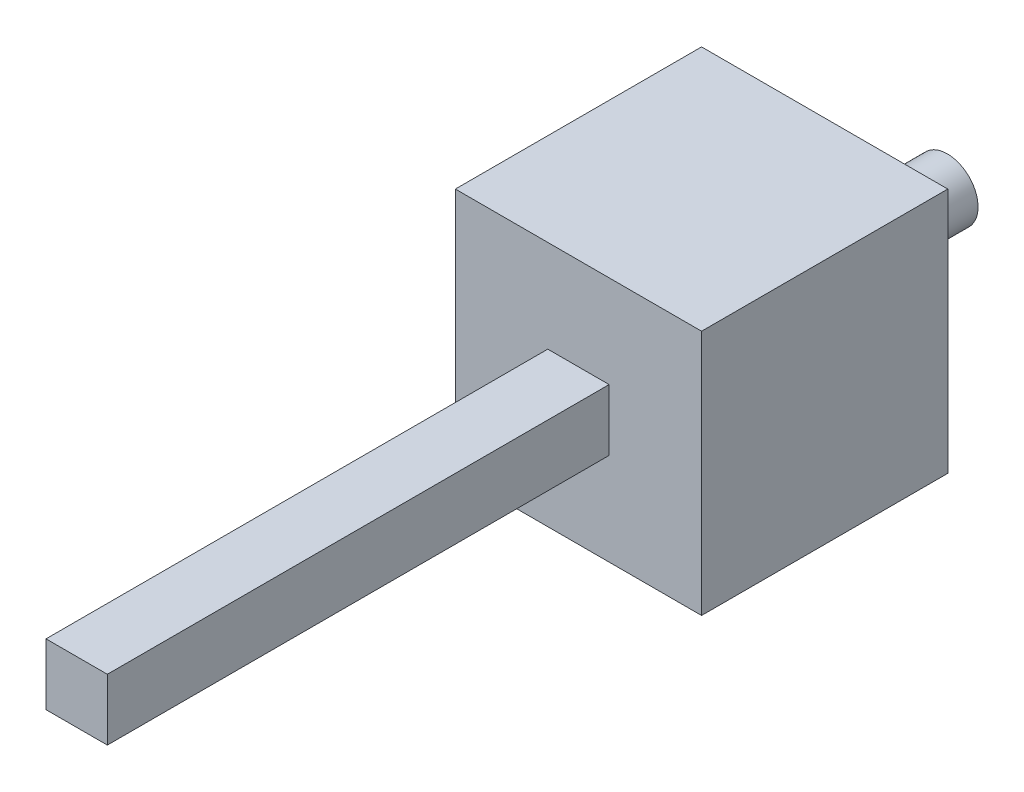
ISO-10303-21;
HEADER;
FILE_DESCRIPTION(('STEP AP214'),'2;1');
FILE_NAME('part.step','',(''),(''),'','','');
FILE_SCHEMA(('AUTOMOTIVE_DESIGN { 1 0 10303 214 1 1 1 1 }'));
ENDSEC;
DATA;
#1=APPLICATION_CONTEXT('core data for automotive mechanical design processes');
#2=APPLICATION_PROTOCOL_DEFINITION('international standard','automotive_design',2000,#1);
#3=PRODUCT_CONTEXT('',#1,'mechanical');
#4=PRODUCT('Part','Part','',(#3));
#5=PRODUCT_RELATED_PRODUCT_CATEGORY('part','',(#4));
#6=PRODUCT_DEFINITION_FORMATION('','',#4);
#7=PRODUCT_DEFINITION_CONTEXT('part definition',#1,'design');
#8=PRODUCT_DEFINITION('design','',#6,#7);
#9=PRODUCT_DEFINITION_SHAPE('','',#8);
#10=(LENGTH_UNIT() NAMED_UNIT(*) SI_UNIT(.MILLI.,.METRE.));
#11=(NAMED_UNIT(*) PLANE_ANGLE_UNIT() SI_UNIT($,.RADIAN.));
#12=(NAMED_UNIT(*) SI_UNIT($,.STERADIAN.) SOLID_ANGLE_UNIT());
#13=UNCERTAINTY_MEASURE_WITH_UNIT(LENGTH_MEASURE(1.E-05),#10,'distance_accuracy_value','');
#14=(GEOMETRIC_REPRESENTATION_CONTEXT(3) GLOBAL_UNCERTAINTY_ASSIGNED_CONTEXT((#13)) GLOBAL_UNIT_ASSIGNED_CONTEXT((#10,
#11,#12)) REPRESENTATION_CONTEXT('',''));
#15=CARTESIAN_POINT('',(0.,0.,0.));
#16=DIRECTION('',(0.,0.,1.));
#17=DIRECTION('',(1.,0.,0.));
#18=AXIS2_PLACEMENT_3D('',#15,#16,#17);
#19=CARTESIAN_POINT('',(-1.0033,-1.0033,2.0066));
#20=DIRECTION('',(1.,0.,0.));
#21=DIRECTION('',(0.,0.,-1.));
#22=AXIS2_PLACEMENT_3D('',#19,#20,#21);
#23=PLANE('',#22);
#24=DIRECTION('',(0.,-1.,0.));
#25=VECTOR('',#24,1.);
#26=CARTESIAN_POINT('',(-1.0033,-1.0033,0.));
#27=LINE('',#26,#25);
#28=CARTESIAN_POINT('',(-1.0033,1.0033,0.));
#29=VERTEX_POINT('',#28);
#30=CARTESIAN_POINT('',(-1.0033,-1.0033,0.));
#31=VERTEX_POINT('',#30);
#32=EDGE_CURVE('E158',#29,#31,#27,.T.);
#33=ORIENTED_EDGE('',*,*,#32,.T.);
#34=DIRECTION('',(0.,0.,-1.));
#35=VECTOR('',#34,1.);
#36=CARTESIAN_POINT('',(-1.0033,-1.0033,2.0066));
#37=LINE('',#36,#35);
#38=CARTESIAN_POINT('',(-1.0033,-1.0033,2.0066));
#39=VERTEX_POINT('',#38);
#40=EDGE_CURVE('E42',#39,#31,#37,.T.);
#41=ORIENTED_EDGE('',*,*,#40,.F.);
#42=DIRECTION('',(0.,-1.,0.));
#43=VECTOR('',#42,1.);
#44=CARTESIAN_POINT('',(-1.0033,-1.0033,2.0066));
#45=LINE('',#44,#43);
#46=CARTESIAN_POINT('',(-1.0033,1.0033,2.0066));
#47=VERTEX_POINT('',#46);
#48=EDGE_CURVE('E159',#47,#39,#45,.T.);
#49=ORIENTED_EDGE('',*,*,#48,.F.);
#50=DIRECTION('',(0.,0.,-1.));
#51=VECTOR('',#50,1.);
#52=CARTESIAN_POINT('',(-1.0033,1.0033,2.0066));
#53=LINE('',#52,#51);
#54=EDGE_CURVE('E173',#47,#29,#53,.T.);
#55=ORIENTED_EDGE('',*,*,#54,.T.);
#56=EDGE_LOOP('',(#33,#41,#49,#55));
#57=FACE_BOUND('',#56,.T.);
#58=ADVANCED_FACE('F39',(#57),#23,.F.);
#59=CARTESIAN_POINT('',(1.0033,-1.0033,2.0066));
#60=DIRECTION('',(0.,1.,0.));
#61=DIRECTION('',(-1.,0.,0.));
#62=AXIS2_PLACEMENT_3D('',#59,#60,#61);
#63=PLANE('',#62);
#64=DIRECTION('',(1.,0.,0.));
#65=VECTOR('',#64,1.);
#66=CARTESIAN_POINT('',(1.0033,-1.0033,0.));
#67=LINE('',#66,#65);
#68=CARTESIAN_POINT('',(1.0033,-1.0033,0.));
#69=VERTEX_POINT('',#68);
#70=EDGE_CURVE('E177',#31,#69,#67,.T.);
#71=ORIENTED_EDGE('',*,*,#70,.T.);
#72=DIRECTION('',(0.,0.,-1.));
#73=VECTOR('',#72,1.);
#74=CARTESIAN_POINT('',(1.0033,-1.0033,2.0066));
#75=LINE('',#74,#73);
#76=CARTESIAN_POINT('',(1.0033,-1.0033,2.0066));
#77=VERTEX_POINT('',#76);
#78=EDGE_CURVE('E191',#77,#69,#75,.T.);
#79=ORIENTED_EDGE('',*,*,#78,.F.);
#80=DIRECTION('',(1.,0.,0.));
#81=VECTOR('',#80,1.);
#82=CARTESIAN_POINT('',(1.0033,-1.0033,2.0066));
#83=LINE('',#82,#81);
#84=EDGE_CURVE('E163',#39,#77,#83,.T.);
#85=ORIENTED_EDGE('',*,*,#84,.F.);
#86=ORIENTED_EDGE('',*,*,#40,.T.);
#87=EDGE_LOOP('',(#71,#79,#85,#86));
#88=FACE_BOUND('',#87,.T.);
#89=ADVANCED_FACE('F202',(#88),#63,.F.);
#90=CARTESIAN_POINT('',(1.0033,-1.0033,2.0066));
#91=DIRECTION('',(-1.,0.,0.));
#92=DIRECTION('',(0.,0.,1.));
#93=AXIS2_PLACEMENT_3D('',#90,#91,#92);
#94=PLANE('',#93);
#95=DIRECTION('',(0.,1.,0.));
#96=VECTOR('',#95,1.);
#97=CARTESIAN_POINT('',(1.0033,-1.0033,0.));
#98=LINE('',#97,#96);
#99=CARTESIAN_POINT('',(1.0033,1.0033,0.));
#100=VERTEX_POINT('',#99);
#101=EDGE_CURVE('E180',#69,#100,#98,.T.);
#102=ORIENTED_EDGE('',*,*,#101,.T.);
#103=DIRECTION('',(0.,0.,-1.));
#104=VECTOR('',#103,1.);
#105=CARTESIAN_POINT('',(1.0033,1.0033,2.0066));
#106=LINE('',#105,#104);
#107=CARTESIAN_POINT('',(1.0033,1.0033,2.0066));
#108=VERTEX_POINT('',#107);
#109=EDGE_CURVE('E188',#108,#100,#106,.T.);
#110=ORIENTED_EDGE('',*,*,#109,.F.);
#111=DIRECTION('',(0.,1.,0.));
#112=VECTOR('',#111,1.);
#113=CARTESIAN_POINT('',(1.0033,-1.0033,2.0066));
#114=LINE('',#113,#112);
#115=EDGE_CURVE('E167',#77,#108,#114,.T.);
#116=ORIENTED_EDGE('',*,*,#115,.F.);
#117=ORIENTED_EDGE('',*,*,#78,.T.);
#118=EDGE_LOOP('',(#102,#110,#116,#117));
#119=FACE_BOUND('',#118,.T.);
#120=ADVANCED_FACE('F211',(#119),#94,.F.);
#121=CARTESIAN_POINT('',(1.0033,1.0033,2.0066));
#122=DIRECTION('',(0.,-1.,0.));
#123=DIRECTION('',(1.,0.,0.));
#124=AXIS2_PLACEMENT_3D('',#121,#122,#123);
#125=PLANE('',#124);
#126=DIRECTION('',(-1.,0.,0.));
#127=VECTOR('',#126,1.);
#128=CARTESIAN_POINT('',(1.0033,1.0033,0.));
#129=LINE('',#128,#127);
#130=EDGE_CURVE('E164',#100,#29,#129,.T.);
#131=ORIENTED_EDGE('',*,*,#130,.T.);
#132=ORIENTED_EDGE('',*,*,#54,.F.);
#133=DIRECTION('',(-1.,0.,0.));
#134=VECTOR('',#133,1.);
#135=CARTESIAN_POINT('',(1.0033,1.0033,2.0066));
#136=LINE('',#135,#134);
#137=EDGE_CURVE('E170',#108,#47,#136,.T.);
#138=ORIENTED_EDGE('',*,*,#137,.F.);
#139=ORIENTED_EDGE('',*,*,#109,.T.);
#140=EDGE_LOOP('',(#131,#132,#138,#139));
#141=FACE_BOUND('',#140,.T.);
#142=ADVANCED_FACE('F214',(#141),#125,.F.);
#143=CARTESIAN_POINT('',(0.,0.,2.0066));
#144=DIRECTION('',(0.,0.,1.));
#145=DIRECTION('',(1.,0.,0.));
#146=AXIS2_PLACEMENT_3D('',#143,#144,#145);
#147=PLANE('',#146);
#148=DIRECTION('',(-1.,0.,0.));
#149=VECTOR('',#148,1.);
#150=CARTESIAN_POINT('',(0.,0.25,2.0066));
#151=LINE('',#150,#149);
#152=CARTESIAN_POINT('',(0.25,0.25,2.0066));
#153=VERTEX_POINT('',#152);
#154=CARTESIAN_POINT('',(-0.25,0.25,2.0066));
#155=VERTEX_POINT('',#154);
#156=EDGE_CURVE('E155',#153,#155,#151,.T.);
#157=ORIENTED_EDGE('',*,*,#156,.F.);
#158=DIRECTION('',(0.,1.,0.));
#159=VECTOR('',#158,1.);
#160=CARTESIAN_POINT('',(0.25,0.,2.0066));
#161=LINE('',#160,#159);
#162=CARTESIAN_POINT('',(0.25,-0.25,2.0066));
#163=VERTEX_POINT('',#162);
#164=EDGE_CURVE('E109',#163,#153,#161,.T.);
#165=ORIENTED_EDGE('',*,*,#164,.F.);
#166=DIRECTION('',(1.,0.,0.));
#167=VECTOR('',#166,1.);
#168=CARTESIAN_POINT('',(0.,-0.25,2.0066));
#169=LINE('',#168,#167);
#170=CARTESIAN_POINT('',(-0.25,-0.25,2.0066));
#171=VERTEX_POINT('',#170);
#172=EDGE_CURVE('E60',#171,#163,#169,.T.);
#173=ORIENTED_EDGE('',*,*,#172,.F.);
#174=DIRECTION('',(0.,-1.,0.));
#175=VECTOR('',#174,1.);
#176=CARTESIAN_POINT('',(-0.25,0.,2.0066));
#177=LINE('',#176,#175);
#178=EDGE_CURVE('E55',#155,#171,#177,.T.);
#179=ORIENTED_EDGE('',*,*,#178,.F.);
#180=EDGE_LOOP('',(#157,#165,#173,#179));
#181=FACE_BOUND('',#180,.T.);
#182=ORIENTED_EDGE('',*,*,#48,.T.);
#183=ORIENTED_EDGE('',*,*,#84,.T.);
#184=ORIENTED_EDGE('',*,*,#115,.T.);
#185=ORIENTED_EDGE('',*,*,#137,.T.);
#186=EDGE_LOOP('',(#182,#183,#184,#185));
#187=FACE_BOUND('',#186,.T.);
#188=ADVANCED_FACE('F216',(#181,#187),#147,.T.);
#189=CARTESIAN_POINT('',(0.,0.,0.));
#190=DIRECTION('',(0.,0.,1.));
#191=DIRECTION('',(1.,0.,0.));
#192=AXIS2_PLACEMENT_3D('',#189,#190,#191);
#193=PLANE('',#192);
#194=CARTESIAN_POINT('',(0.,0.,0.));
#195=DIRECTION('',(0.,0.,-1.));
#196=DIRECTION('',(-1.,0.,0.));
#197=AXIS2_PLACEMENT_3D('',#194,#195,#196);
#198=CIRCLE('',#197,0.25);
#199=CARTESIAN_POINT('',(-0.25,0.,0.));
#200=VERTEX_POINT('',#199);
#201=EDGE_CURVE('E11',#200,#200,#198,.T.);
#202=ORIENTED_EDGE('',*,*,#201,.F.);
#203=EDGE_LOOP('',(#202));
#204=FACE_BOUND('',#203,.T.);
#205=ORIENTED_EDGE('',*,*,#32,.F.);
#206=ORIENTED_EDGE('',*,*,#130,.F.);
#207=ORIENTED_EDGE('',*,*,#101,.F.);
#208=ORIENTED_EDGE('',*,*,#70,.F.);
#209=EDGE_LOOP('',(#205,#206,#207,#208));
#210=FACE_BOUND('',#209,.T.);
#211=ADVANCED_FACE('F209',(#204,#210),#193,.F.);
#212=CARTESIAN_POINT('',(-0.25,0.25,6.096));
#213=DIRECTION('',(0.,1.,0.));
#214=DIRECTION('',(-1.,0.,0.));
#215=AXIS2_PLACEMENT_3D('',#212,#213,#214);
#216=PLANE('',#215);
#217=DIRECTION('',(0.,0.,-1.));
#218=VECTOR('',#217,1.);
#219=CARTESIAN_POINT('',(0.25,0.25,6.096));
#220=LINE('',#219,#218);
#221=CARTESIAN_POINT('',(0.25,0.25,6.096));
#222=VERTEX_POINT('',#221);
#223=EDGE_CURVE('E104',#222,#153,#220,.T.);
#224=ORIENTED_EDGE('',*,*,#223,.T.);
#225=ORIENTED_EDGE('',*,*,#156,.T.);
#226=DIRECTION('',(0.,0.,-1.));
#227=VECTOR('',#226,1.);
#228=CARTESIAN_POINT('',(-0.25,0.25,6.096));
#229=LINE('',#228,#227);
#230=CARTESIAN_POINT('',(-0.25,0.25,6.096));
#231=VERTEX_POINT('',#230);
#232=EDGE_CURVE('E129',#231,#155,#229,.T.);
#233=ORIENTED_EDGE('',*,*,#232,.F.);
#234=DIRECTION('',(1.,0.,0.));
#235=VECTOR('',#234,1.);
#236=CARTESIAN_POINT('',(-0.25,0.25,6.096));
#237=LINE('',#236,#235);
#238=EDGE_CURVE('E121',#231,#222,#237,.T.);
#239=ORIENTED_EDGE('',*,*,#238,.T.);
#240=EDGE_LOOP('',(#224,#225,#233,#239));
#241=FACE_BOUND('',#240,.T.);
#242=ADVANCED_FACE('F127',(#241),#216,.T.);
#243=CARTESIAN_POINT('',(-0.25,-0.25,6.096));
#244=DIRECTION('',(-1.,0.,0.));
#245=DIRECTION('',(0.,-1.,0.));
#246=AXIS2_PLACEMENT_3D('',#243,#244,#245);
#247=PLANE('',#246);
#248=ORIENTED_EDGE('',*,*,#232,.T.);
#249=ORIENTED_EDGE('',*,*,#178,.T.);
#250=DIRECTION('',(0.,0.,-1.));
#251=VECTOR('',#250,1.);
#252=CARTESIAN_POINT('',(-0.25,-0.25,6.096));
#253=LINE('',#252,#251);
#254=CARTESIAN_POINT('',(-0.25,-0.25,6.096));
#255=VERTEX_POINT('',#254);
#256=EDGE_CURVE('E143',#255,#171,#253,.T.);
#257=ORIENTED_EDGE('',*,*,#256,.F.);
#258=DIRECTION('',(0.,1.,0.));
#259=VECTOR('',#258,1.);
#260=CARTESIAN_POINT('',(-0.25,-0.25,6.096));
#261=LINE('',#260,#259);
#262=EDGE_CURVE('E114',#255,#231,#261,.T.);
#263=ORIENTED_EDGE('',*,*,#262,.T.);
#264=EDGE_LOOP('',(#248,#249,#257,#263));
#265=FACE_BOUND('',#264,.T.);
#266=ADVANCED_FACE('F255',(#265),#247,.T.);
#267=CARTESIAN_POINT('',(0.25,-0.25,6.096));
#268=DIRECTION('',(0.,-1.,0.));
#269=DIRECTION('',(1.,0.,0.));
#270=AXIS2_PLACEMENT_3D('',#267,#268,#269);
#271=PLANE('',#270);
#272=ORIENTED_EDGE('',*,*,#256,.T.);
#273=ORIENTED_EDGE('',*,*,#172,.T.);
#274=DIRECTION('',(0.,0.,-1.));
#275=VECTOR('',#274,1.);
#276=CARTESIAN_POINT('',(0.25,-0.25,6.096));
#277=LINE('',#276,#275);
#278=CARTESIAN_POINT('',(0.25,-0.25,6.096));
#279=VERTEX_POINT('',#278);
#280=EDGE_CURVE('E113',#279,#163,#277,.T.);
#281=ORIENTED_EDGE('',*,*,#280,.F.);
#282=DIRECTION('',(-1.,0.,0.));
#283=VECTOR('',#282,1.);
#284=CARTESIAN_POINT('',(0.25,-0.25,6.096));
#285=LINE('',#284,#283);
#286=EDGE_CURVE('E124',#279,#255,#285,.T.);
#287=ORIENTED_EDGE('',*,*,#286,.T.);
#288=EDGE_LOOP('',(#272,#273,#281,#287));
#289=FACE_BOUND('',#288,.T.);
#290=ADVANCED_FACE('F263',(#289),#271,.T.);
#291=CARTESIAN_POINT('',(0.25,0.25,6.096));
#292=DIRECTION('',(1.,0.,0.));
#293=DIRECTION('',(0.,1.,0.));
#294=AXIS2_PLACEMENT_3D('',#291,#292,#293);
#295=PLANE('',#294);
#296=ORIENTED_EDGE('',*,*,#280,.T.);
#297=ORIENTED_EDGE('',*,*,#164,.T.);
#298=ORIENTED_EDGE('',*,*,#223,.F.);
#299=DIRECTION('',(0.,-1.,0.));
#300=VECTOR('',#299,1.);
#301=CARTESIAN_POINT('',(0.25,0.25,6.096));
#302=LINE('',#301,#300);
#303=EDGE_CURVE('E108',#222,#279,#302,.T.);
#304=ORIENTED_EDGE('',*,*,#303,.T.);
#305=EDGE_LOOP('',(#296,#297,#298,#304));
#306=FACE_BOUND('',#305,.T.);
#307=ADVANCED_FACE('F107',(#306),#295,.T.);
#308=CARTESIAN_POINT('',(0.,0.,6.096));
#309=DIRECTION('',(0.,0.,-1.));
#310=DIRECTION('',(-1.,0.,0.));
#311=AXIS2_PLACEMENT_3D('',#308,#309,#310);
#312=PLANE('',#311);
#313=ORIENTED_EDGE('',*,*,#238,.F.);
#314=ORIENTED_EDGE('',*,*,#262,.F.);
#315=ORIENTED_EDGE('',*,*,#286,.F.);
#316=ORIENTED_EDGE('',*,*,#303,.F.);
#317=EDGE_LOOP('',(#313,#314,#315,#316));
#318=FACE_BOUND('',#317,.T.);
#319=ADVANCED_FACE('F119',(#318),#312,.F.);
#320=CARTESIAN_POINT('',(0.,0.,-1.));
#321=DIRECTION('',(0.,0.,1.));
#322=DIRECTION('',(1.,0.,0.));
#323=AXIS2_PLACEMENT_3D('',#320,#321,#322);
#324=CYLINDRICAL_SURFACE('',#323,0.25);
#325=CARTESIAN_POINT('',(0.,0.,-1.));
#326=DIRECTION('',(0.,0.,-1.));
#327=DIRECTION('',(-1.,0.,0.));
#328=AXIS2_PLACEMENT_3D('',#325,#326,#327);
#329=CIRCLE('',#328,0.25);
#330=CARTESIAN_POINT('',(-0.25,0.,-1.));
#331=VERTEX_POINT('',#330);
#332=EDGE_CURVE('E131',#331,#331,#329,.T.);
#333=ORIENTED_EDGE('',*,*,#332,.F.);
#334=EDGE_LOOP('',(#333));
#335=FACE_BOUND('',#334,.T.);
#336=ORIENTED_EDGE('',*,*,#201,.T.);
#337=EDGE_LOOP('',(#336));
#338=FACE_BOUND('',#337,.T.);
#339=ADVANCED_FACE('F290',(#335,#338),#324,.T.);
#340=CARTESIAN_POINT('',(0.,0.,-1.));
#341=DIRECTION('',(0.,0.,-1.));
#342=DIRECTION('',(-1.,0.,0.));
#343=AXIS2_PLACEMENT_3D('',#340,#341,#342);
#344=PLANE('',#343);
#345=ORIENTED_EDGE('',*,*,#332,.T.);
#346=EDGE_LOOP('',(#345));
#347=FACE_BOUND('',#346,.T.);
#348=ADVANCED_FACE('F304',(#347),#344,.T.);
#349=CLOSED_SHELL('',(#58,#89,#120,#142,#188,#211,#242,#266,#290,#307,#319,#339,#348));
#350=MANIFOLD_SOLID_BREP('B2',#349);
#351=ADVANCED_BREP_SHAPE_REPRESENTATION('',(#18,#350),#14);
#352=SHAPE_DEFINITION_REPRESENTATION(#9,#351);
ENDSEC;
END-ISO-10303-21;
